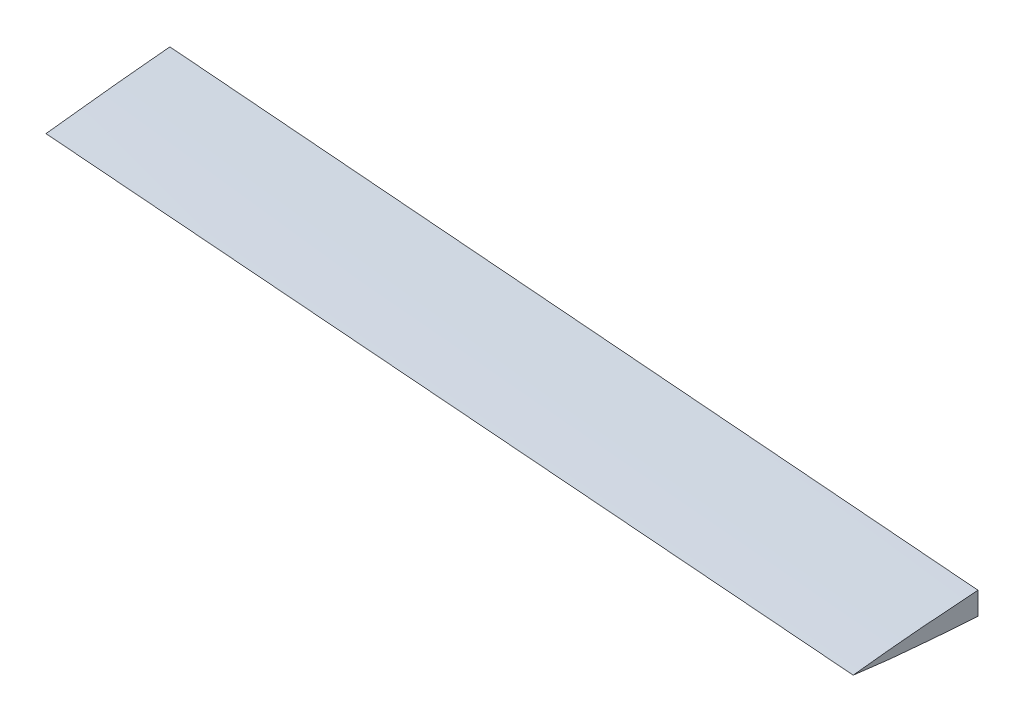
ISO-10303-21;
HEADER;
FILE_DESCRIPTION(('STEP AP214'),'2;1');
FILE_NAME('part.step','',(''),(''),'','','');
FILE_SCHEMA(('AUTOMOTIVE_DESIGN { 1 0 10303 214 1 1 1 1 }'));
ENDSEC;
DATA;
#1=APPLICATION_CONTEXT('core data for automotive mechanical design processes');
#2=APPLICATION_PROTOCOL_DEFINITION('international standard','automotive_design',2000,#1);
#3=PRODUCT_CONTEXT('',#1,'mechanical');
#4=PRODUCT('Part','Part','',(#3));
#5=PRODUCT_RELATED_PRODUCT_CATEGORY('part','',(#4));
#6=PRODUCT_DEFINITION_FORMATION('','',#4);
#7=PRODUCT_DEFINITION_CONTEXT('part definition',#1,'design');
#8=PRODUCT_DEFINITION('design','',#6,#7);
#9=PRODUCT_DEFINITION_SHAPE('','',#8);
#10=(LENGTH_UNIT() NAMED_UNIT(*) SI_UNIT(.MILLI.,.METRE.));
#11=(NAMED_UNIT(*) PLANE_ANGLE_UNIT() SI_UNIT($,.RADIAN.));
#12=(NAMED_UNIT(*) SI_UNIT($,.STERADIAN.) SOLID_ANGLE_UNIT());
#13=UNCERTAINTY_MEASURE_WITH_UNIT(LENGTH_MEASURE(1.E-05),#10,'distance_accuracy_value','');
#14=(GEOMETRIC_REPRESENTATION_CONTEXT(3) GLOBAL_UNCERTAINTY_ASSIGNED_CONTEXT((#13)) GLOBAL_UNIT_ASSIGNED_CONTEXT((#10,
#11,#12)) REPRESENTATION_CONTEXT('',''));
#15=CARTESIAN_POINT('',(0.,0.,0.));
#16=DIRECTION('',(0.,0.,1.));
#17=DIRECTION('',(1.,0.,0.));
#18=AXIS2_PLACEMENT_3D('',#15,#16,#17);
#19=CARTESIAN_POINT('',(228.3,-0.0516787163882843,86.9807899058097));
#20=CARTESIAN_POINT('',(0.,-0.0445526759174798,69.8769829551548));
#21=CARTESIAN_POINT('',(228.3,0.183952983179227,84.8497145663245));
#22=CARTESIAN_POINT('',(0.,0.191269611960595,67.7441839169929));
#23=CARTESIAN_POINT('',(228.3,0.426414872881976,82.7194259061844));
#24=CARTESIAN_POINT('',(0.,0.434225079009235,65.6121466777225));
#25=CARTESIAN_POINT('',(228.3,0.789442250355302,79.4063898446891));
#26=CARTESIAN_POINT('',(0.,0.804501218770761,62.297253752371));
#27=CARTESIAN_POINT('',(228.300000000001,1.61302964821892,71.5021636724031));
#28=CARTESIAN_POINT('',(0.,1.67767806493391,54.391740819047));
#29=CARTESIAN_POINT('',(228.3,2.18976729307911,63.5740356391606));
#30=CARTESIAN_POINT('',(0.,2.39508772941185,46.4697591761005));
#31=CARTESIAN_POINT('',(228.3,2.64303276707893,56.830789905849));
#32=CARTESIAN_POINT('',(0.,2.92959517006794,39.7269829551548));
#33=B_SPLINE_SURFACE_WITH_KNOTS('',3,1,((#19,#20),(#21,#22),(#23,#24),(#25,#26),(#27,#28),(#29,
#30),(#31,#32)),.UNSPECIFIED.,.F.,.F.,.F.,(4,2,1,4),(2,2),(0.,0.212467043980473,
0.330266538666576,1.),(0.,1.),.UNSPECIFIED.);
#34=DIRECTION('',(-0.997204614939109,0.00125169229403715,-0.0747086956822595));
#35=VECTOR('',#34,1.);
#36=CARTESIAN_POINT('',(228.3,2.64303276707893,56.830789905849));
#37=LINE('',#36,#35);
#38=CARTESIAN_POINT('',(228.3,2.64303276707893,56.830789905849));
#39=VERTEX_POINT('',#38);
#40=CARTESIAN_POINT('',(17.2567064281449,2.90793453379232,41.0198229698363));
#41=VERTEX_POINT('',#40);
#42=EDGE_CURVE('E121',#39,#41,#37,.T.);
#43=CARTESIAN_POINT('',(17.2567064281449,2.90793453379232,41.0198229698363));
#44=CARTESIAN_POINT('',(17.2662960908569,2.85101960279689,41.7467138353617));
#45=CARTESIAN_POINT('',(17.2757402987279,2.79326217973608,42.47354097835));
#46=CARTESIAN_POINT('',(17.2943005735251,2.67594928909473,43.9270555956628));
#47=CARTESIAN_POINT('',(17.3034166398633,2.6163938182927,44.6537430697347));
#48=CARTESIAN_POINT('',(17.3212833661361,2.49537197197409,46.1069635561481));
#49=CARTESIAN_POINT('',(17.3300340260528,2.43390559636427,46.8334965684819));
#50=CARTESIAN_POINT('',(17.3471246353684,2.30894873100236,48.2863928514362));
#51=CARTESIAN_POINT('',(17.3554645850997,2.24545824288928,49.0127561221937));
#52=CARTESIAN_POINT('',(17.3716821913385,2.11633918107709,50.4653049711971));
#53=CARTESIAN_POINT('',(17.379559843378,2.05071058672332,51.1914905476581));
#54=CARTESIAN_POINT('',(17.3947938052818,1.91720175075915,52.6436611902122));
#55=CARTESIAN_POINT('',(17.4021501145032,1.84932150637194,53.3696462560569));
#56=CARTESIAN_POINT('',(17.4162746966255,1.71119722996217,54.8213983106958));
#57=CARTESIAN_POINT('',(17.4230429687721,1.64095319490765,55.5471652992091));
#58=CARTESIAN_POINT('',(17.4359169837983,1.4979815009895,56.9984584630305));
#59=CARTESIAN_POINT('',(17.4420227286078,1.42525384936126,57.723984639034));
#60=CARTESIAN_POINT('',(17.4533517059205,1.27897356072038,59.1576315893612));
#61=CARTESIAN_POINT('',(17.4585923891878,1.2054810728117,59.8657583569422));
#62=CARTESIAN_POINT('',(17.4682793791383,1.05585226812369,61.2817401058223));
#63=CARTESIAN_POINT('',(17.472725683364,0.979715943166265,61.9895950862739));
#64=CARTESIAN_POINT('',(17.4806999409408,0.825287415854562,63.405079303521));
#65=CARTESIAN_POINT('',(17.4842278877924,0.746995198246379,64.1127085386834));
#66=CARTESIAN_POINT('',(17.4902561225545,0.589218935085235,65.5278454531917));
#67=CARTESIAN_POINT('',(17.492756399674,0.509734877026444,66.2353531311833));
#68=CARTESIAN_POINT('',(17.496668939557,0.350564158537459,67.6503446040933));
#69=CARTESIAN_POINT('',(17.4980812085963,0.270877499278538,68.357828399126));
#70=CARTESIAN_POINT('',(17.4998226334634,0.112171661612615,69.7728614265091));
#71=CARTESIAN_POINT('',(17.5001518053487,0.0331524733273668,70.4804106577339));
#72=CARTESIAN_POINT('',(17.4999418881406,-0.0450989102325547,71.1880457133783));
#73=B_SPLINE_CURVE_WITH_KNOTS('',3,(#43,#44,#45,#46,#47,#48,#49,#50,#51,#52,#53,#54,#55,#56,#57,
#58,#59,#60,#61,#62,#63,#64,#65,#66,#67,#68,#69,#70,#71,#72),.UNSPECIFIED.,.F.,.F.,(4,2,2,2,2,2,
2,2,2,2,2,2,2,2,4),(0.,2.18753612689554,4.37507617334737,6.56261632655044,8.75015470846871,
10.9377142288459,13.1252764470976,15.3128414713709,17.5004001232687,19.6362435390059,
21.7720935620558,23.907958701083,26.0438462671755,28.1797215132877,30.3155650939093),.UNSPECIFIED.);
#74=CARTESIAN_POINT('',(17.4999418881406,-0.0450989102325547,71.1880457133783));
#75=VERTEX_POINT('',#74);
#76=EDGE_CURVE('E114',#41,#75,#73,.T.);
#77=DIRECTION('',(-0.997205395633959,3.11262637187557E-05,-0.0747087541702793));
#78=VECTOR('',#77,1.);
#79=CARTESIAN_POINT('',(114.15,-0.0481156961528819,78.4288864304823));
#80=LINE('',#79,#78);
#81=CARTESIAN_POINT('',(228.3,-0.0516787163882843,86.9807899058097));
#82=VERTEX_POINT('',#81);
#83=EDGE_CURVE('E87',#82,#75,#80,.T.);
#84=CARTESIAN_POINT('',(228.3,2.64303276707893,56.830789905849));
#85=CARTESIAN_POINT('',(228.3,2.36141526864303,61.0204229215648));
#86=CARTESIAN_POINT('',(228.3,1.85733246976838,67.9883236284306));
#87=CARTESIAN_POINT('',(228.3,0.969887496558844,78.0412337896448));
#88=CARTESIAN_POINT('',(228.3,0.289567902039122,83.8945232678821));
#89=CARTESIAN_POINT('',(228.3,-0.0516787163882843,86.9807899058097));
#90=B_SPLINE_CURVE_WITH_KNOTS('',3,(#84,#85,#86,#87,#88,#89),.UNSPECIFIED.,.F.,.F.,(4,1,1,4),
(0.,0.138660145050742,0.230691919934423,0.333231216956297),.UNSPECIFIED.);
#91=EDGE_CURVE('E135',#39,#82,#90,.T.);
#92=ORIENTED_EDGE('',*,*,#42,.T.);
#93=ORIENTED_EDGE('',*,*,#76,.T.);
#94=ORIENTED_EDGE('',*,*,#83,.F.);
#95=ORIENTED_EDGE('',*,*,#91,.F.);
#96=EDGE_LOOP('',(#92,#93,#94,#95));
#97=FACE_BOUND('',#96,.T.);
#98=ADVANCED_FACE('F73',(#97),#33,.T.);
#99=CARTESIAN_POINT('',(228.3,-2.80109384016926,56.830789905849));
#100=CARTESIAN_POINT('',(0.,-3.14670042923025,39.7269829551548));
#101=CARTESIAN_POINT('',(228.3,-2.13336023803044,66.9026735232579));
#102=CARTESIAN_POINT('',(0.,-2.37620746568041,49.8022631041999));
#103=CARTESIAN_POINT('',(228.3,-1.44338002836328,76.9831672133563));
#104=CARTESIAN_POINT('',(0.,-1.43772638916746,59.8687829124051));
#105=CARTESIAN_POINT('',(228.3,-0.051678716388284,86.9807899058097));
#106=CARTESIAN_POINT('',(0.,-0.0445526759174798,69.8769829551548));
#107=B_SPLINE_SURFACE_WITH_KNOTS('',3,1,((#99,#100),(#101,#102),(#103,#104),(#105,#106)),
.UNSPECIFIED.,.F.,.F.,.F.,(4,4),(2,2),(0.,1.),(0.,1.),.UNSPECIFIED.);
#108=CARTESIAN_POINT('',(17.4999418881406,-0.0450989102325547,71.1880457133783));
#109=CARTESIAN_POINT('',(17.4996788963592,-0.145645260323295,70.4657271490684));
#110=CARTESIAN_POINT('',(17.4985639609145,-0.24371896900799,69.7430685689385));
#111=CARTESIAN_POINT('',(17.4948514682592,-0.435159960482737,68.2971368083583));
#112=CARTESIAN_POINT('',(17.4922539212598,-0.528527275682814,67.5738636321751));
#113=CARTESIAN_POINT('',(17.4825697017303,-0.801916657116699,65.4033108449921));
#114=CARTESIAN_POINT('',(17.4735913478642,-0.975240738876107,63.9551927163899));
#115=CARTESIAN_POINT('',(17.4519898605179,-1.30593817969406,61.0572187335389));
#116=CARTESIAN_POINT('',(17.4393668309239,-1.46331199321927,59.6073629299928));
#117=CARTESIAN_POINT('',(17.4115182478026,-1.76404129278061,56.7061719243616));
#118=CARTESIAN_POINT('',(17.3962925950292,-1.90739624390615,55.2548366679589));
#119=CARTESIAN_POINT('',(17.3682936485257,-2.14537155768794,52.7383567519397));
#120=CARTESIAN_POINT('',(17.3559496304805,-2.24279111239778,51.6734699253079));
#121=CARTESIAN_POINT('',(17.3304669271383,-2.43187533467596,49.5431905787456));
#122=CARTESIAN_POINT('',(17.3173282382586,-2.52353997629514,48.4777980565568));
#123=CARTESIAN_POINT('',(17.2904049843419,-2.70185965405739,46.3466906074741));
#124=CARTESIAN_POINT('',(17.2766204716153,-2.78851509466896,45.2809757136149));
#125=CARTESIAN_POINT('',(17.2484784231795,-2.95757455891258,43.1492279871856));
#126=CARTESIAN_POINT('',(17.2341208939714,-3.0399786307535,42.0831951583587));
#127=CARTESIAN_POINT('',(17.2195136174643,-3.12063307326607,41.0170365543574));
#128=B_SPLINE_CURVE_WITH_KNOTS('',3,(#108,#109,#110,#111,#112,#113,#114,#115,#116,#117,#118,
#119,#120,#121,#122,#123,#124,#125,#126,#127),.UNSPECIFIED.,.F.,.F.,(4,2,2,2,2,2,2,2,2,4),(0.,
2.18783792118042,4.37566077401332,8.75098771311162,13.1261899521383,17.5015590684447,
20.7097579093558,23.917971215143,27.1259251104978,30.3338426209017),.UNSPECIFIED.);
#129=CARTESIAN_POINT('',(17.2195136174643,-3.12063307326607,41.0170365543574));
#130=VERTEX_POINT('',#129);
#131=EDGE_CURVE('E12',#75,#130,#128,.T.);
#132=DIRECTION('',(-0.997204259863273,-0.00150959423061075,-0.0747086690806453));
#133=VECTOR('',#132,1.);
#134=CARTESIAN_POINT('',(228.3,-2.80109384016926,56.830789905849));
#135=LINE('',#134,#133);
#136=CARTESIAN_POINT('',(228.3,-2.80109384016926,56.830789905849));
#137=VERTEX_POINT('',#136);
#138=EDGE_CURVE('E101',#137,#130,#135,.T.);
#139=CARTESIAN_POINT('',(228.3,-0.051678716388284,86.9807899058097));
#140=CARTESIAN_POINT('',(228.3,-1.34728885075288,77.6734614090691));
#141=CARTESIAN_POINT('',(228.3,-2.08093906497791,67.6013918383378));
#142=CARTESIAN_POINT('',(228.3,-2.75483806188307,57.5284975156486));
#143=CARTESIAN_POINT('',(228.3,-2.80109384016926,56.830789905849));
#144=B_SPLINE_CURVE_WITH_KNOTS('',3,(#139,#140,#141,#142,#143),.UNSPECIFIED.,.F.,.F.,(4,1,4),
(0.666923593765508,0.976929567901546,1.),.UNSPECIFIED.);
#145=EDGE_CURVE('E124',#82,#137,#144,.T.);
#146=ORIENTED_EDGE('',*,*,#83,.T.);
#147=ORIENTED_EDGE('',*,*,#131,.T.);
#148=ORIENTED_EDGE('',*,*,#138,.F.);
#149=ORIENTED_EDGE('',*,*,#145,.F.);
#150=EDGE_LOOP('',(#146,#147,#148,#149));
#151=FACE_BOUND('',#150,.T.);
#152=ADVANCED_FACE('F75',(#151),#107,.T.);
#153=CARTESIAN_POINT('',(228.3,-1.69616810032296,71.9330260828852));
#154=DIRECTION('',(1.,0.,0.));
#155=DIRECTION('',(0.,0.,-1.));
#156=AXIS2_PLACEMENT_3D('',#153,#154,#155);
#157=PLANE('',#156);
#158=ORIENTED_EDGE('',*,*,#145,.T.);
#159=DIRECTION('',(0.,1.,0.));
#160=VECTOR('',#159,1.);
#161=CARTESIAN_POINT('',(228.3,2.64303276707893,56.830789905849));
#162=LINE('',#161,#160);
#163=EDGE_CURVE('E180',#137,#39,#162,.T.);
#164=ORIENTED_EDGE('',*,*,#163,.T.);
#165=ORIENTED_EDGE('',*,*,#91,.T.);
#166=EDGE_LOOP('',(#158,#164,#165));
#167=FACE_BOUND('',#166,.T.);
#168=ADVANCED_FACE('F168',(#167),#157,.T.);
#169=CARTESIAN_POINT('',(-2.959659150858,-1.3534039276475E-13,39.5052508537263));
#170=DIRECTION('',(0.0747087542066402,0.,-0.997205396117015));
#171=DIRECTION('',(-0.997205396117015,0.,-0.0747087542066402));
#172=AXIS2_PLACEMENT_3D('',#169,#170,#171);
#173=PLANE('',#172);
#174=ORIENTED_EDGE('',*,*,#138,.T.);
#175=CARTESIAN_POINT('',(0.,0.,39.7269829551548));
#176=DIRECTION('',(0.0747087542066402,0.,-0.997205396117015));
#177=DIRECTION('',(-0.997205396117015,0.,-0.0747087542066402));
#178=AXIS2_PLACEMENT_3D('',#175,#176,#177);
#179=ELLIPSE('',#178,17.549042622656,17.5);
#180=EDGE_CURVE('E95',#130,#41,#179,.F.);
#181=ORIENTED_EDGE('',*,*,#180,.T.);
#182=ORIENTED_EDGE('',*,*,#42,.F.);
#183=ORIENTED_EDGE('',*,*,#163,.F.);
#184=EDGE_LOOP('',(#174,#181,#182,#183));
#185=FACE_BOUND('',#184,.T.);
#186=ADVANCED_FACE('F150',(#185),#173,.T.);
#187=CARTESIAN_POINT('',(0.,0.,98.));
#188=DIRECTION('',(0.,0.,-1.));
#189=DIRECTION('',(-1.,0.,0.));
#190=AXIS2_PLACEMENT_3D('',#187,#188,#189);
#191=CYLINDRICAL_SURFACE('',#190,17.5);
#192=ORIENTED_EDGE('',*,*,#131,.F.);
#193=ORIENTED_EDGE('',*,*,#76,.F.);
#194=ORIENTED_EDGE('',*,*,#180,.F.);
#195=EDGE_LOOP('',(#192,#193,#194));
#196=FACE_BOUND('',#195,.T.);
#197=ADVANCED_FACE('F113',(#196),#191,.F.);
#198=CLOSED_SHELL('',(#98,#152,#168,#186,#197));
#199=MANIFOLD_SOLID_BREP('B2',#198);
#200=ADVANCED_BREP_SHAPE_REPRESENTATION('',(#18,#199),#14);
#201=SHAPE_DEFINITION_REPRESENTATION(#9,#200);
ENDSEC;
END-ISO-10303-21;
